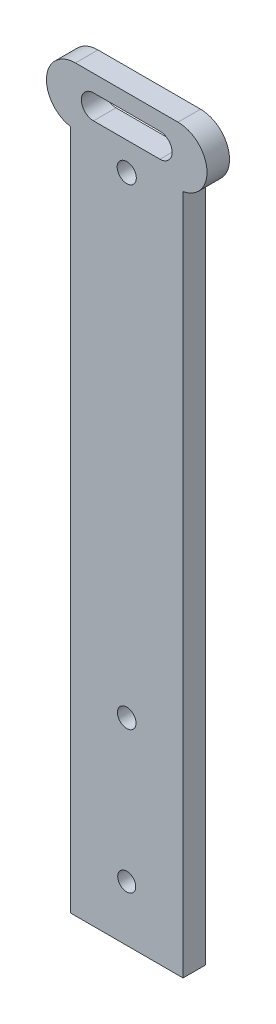
ISO-10303-21;
HEADER;
FILE_DESCRIPTION(('STEP AP214'),'2;1');
FILE_NAME('part.step','',(''),(''),'','','');
FILE_SCHEMA(('AUTOMOTIVE_DESIGN { 1 0 10303 214 1 1 1 1 }'));
ENDSEC;
DATA;
#1=APPLICATION_CONTEXT('core data for automotive mechanical design processes');
#2=APPLICATION_PROTOCOL_DEFINITION('international standard','automotive_design',2000,#1);
#3=PRODUCT_CONTEXT('',#1,'mechanical');
#4=PRODUCT('Part','Part','',(#3));
#5=PRODUCT_RELATED_PRODUCT_CATEGORY('part','',(#4));
#6=PRODUCT_DEFINITION_FORMATION('','',#4);
#7=PRODUCT_DEFINITION_CONTEXT('part definition',#1,'design');
#8=PRODUCT_DEFINITION('design','',#6,#7);
#9=PRODUCT_DEFINITION_SHAPE('','',#8);
#10=(LENGTH_UNIT() NAMED_UNIT(*) SI_UNIT(.MILLI.,.METRE.));
#11=(NAMED_UNIT(*) PLANE_ANGLE_UNIT() SI_UNIT($,.RADIAN.));
#12=(NAMED_UNIT(*) SI_UNIT($,.STERADIAN.) SOLID_ANGLE_UNIT());
#13=UNCERTAINTY_MEASURE_WITH_UNIT(LENGTH_MEASURE(1.E-05),#10,'distance_accuracy_value','');
#14=(GEOMETRIC_REPRESENTATION_CONTEXT(3) GLOBAL_UNCERTAINTY_ASSIGNED_CONTEXT((#13)) GLOBAL_UNIT_ASSIGNED_CONTEXT((#10,
#11,#12)) REPRESENTATION_CONTEXT('',''));
#15=CARTESIAN_POINT('',(0.,0.,0.));
#16=DIRECTION('',(0.,0.,1.));
#17=DIRECTION('',(1.,0.,0.));
#18=AXIS2_PLACEMENT_3D('',#15,#16,#17);
#19=CARTESIAN_POINT('',(0.,0.,0.));
#20=DIRECTION('',(0.,0.,1.));
#21=DIRECTION('',(1.,0.,0.));
#22=AXIS2_PLACEMENT_3D('',#19,#20,#21);
#23=PLANE('',#22);
#24=CARTESIAN_POINT('',(10.,-88.82,0.));
#25=DIRECTION('',(0.,0.,-1.));
#26=DIRECTION('',(-1.,0.,0.));
#27=AXIS2_PLACEMENT_3D('',#24,#25,#26);
#28=CIRCLE('',#27,1.65);
#29=CARTESIAN_POINT('',(8.35,-88.82,0.));
#30=VERTEX_POINT('',#29);
#31=EDGE_CURVE('E251',#30,#30,#28,.T.);
#32=ORIENTED_EDGE('',*,*,#31,.F.);
#33=EDGE_LOOP('',(#32));
#34=FACE_BOUND('',#33,.T.);
#35=DIRECTION('',(0.,1.,0.));
#36=VECTOR('',#35,1.);
#37=CARTESIAN_POINT('',(20.,-124.,0.));
#38=LINE('',#37,#36);
#39=CARTESIAN_POINT('',(20.,-2.92085704174845,0.));
#40=VERTEX_POINT('',#39);
#41=CARTESIAN_POINT('',(20.,-123.82,0.));
#42=VERTEX_POINT('',#41);
#43=EDGE_CURVE('E130',#40,#42,#38,.F.);
#44=ORIENTED_EDGE('',*,*,#43,.T.);
#45=DIRECTION('',(1.,0.,0.));
#46=VECTOR('',#45,1.);
#47=CARTESIAN_POINT('',(20.,-123.82,0.));
#48=LINE('',#47,#46);
#49=CARTESIAN_POINT('',(0.,-123.82,0.));
#50=VERTEX_POINT('',#49);
#51=EDGE_CURVE('E115',#50,#42,#48,.T.);
#52=ORIENTED_EDGE('',*,*,#51,.F.);
#53=DIRECTION('',(0.,1.,0.));
#54=VECTOR('',#53,1.);
#55=CARTESIAN_POINT('',(0.,0.,0.));
#56=LINE('',#55,#54);
#57=CARTESIAN_POINT('',(0.,-2.92085704174845,0.));
#58=VERTEX_POINT('',#57);
#59=EDGE_CURVE('E127',#50,#58,#56,.T.);
#60=ORIENTED_EDGE('',*,*,#59,.T.);
#61=CARTESIAN_POINT('',(0.899393608021611,2.15,0.));
#62=DIRECTION('',(0.,0.,1.));
#63=DIRECTION('',(1.,0.,0.));
#64=AXIS2_PLACEMENT_3D('',#61,#62,#63);
#65=CIRCLE('',#64,5.15);
#66=CARTESIAN_POINT('',(0.89939360802161,7.3,0.));
#67=VERTEX_POINT('',#66);
#68=EDGE_CURVE('E135',#67,#58,#65,.T.);
#69=ORIENTED_EDGE('',*,*,#68,.F.);
#70=DIRECTION('',(-1.,0.,0.));
#71=VECTOR('',#70,1.);
#72=CARTESIAN_POINT('',(0.899393608021611,7.3,0.));
#73=LINE('',#72,#71);
#74=CARTESIAN_POINT('',(19.1006063919784,7.3,0.));
#75=VERTEX_POINT('',#74);
#76=EDGE_CURVE('E199',#75,#67,#73,.T.);
#77=ORIENTED_EDGE('',*,*,#76,.F.);
#78=CARTESIAN_POINT('',(19.1006063919784,2.15,0.));
#79=DIRECTION('',(0.,0.,1.));
#80=DIRECTION('',(1.,0.,0.));
#81=AXIS2_PLACEMENT_3D('',#78,#79,#80);
#82=CIRCLE('',#81,5.15);
#83=EDGE_CURVE('E174',#40,#75,#82,.T.);
#84=ORIENTED_EDGE('',*,*,#83,.F.);
#85=EDGE_LOOP('',(#44,#52,#60,#69,#77,#84));
#86=FACE_BOUND('',#85,.T.);
#87=DIRECTION('',(1.,0.,0.));
#88=VECTOR('',#87,1.);
#89=CARTESIAN_POINT('',(20.,0.,0.));
#90=LINE('',#89,#88);
#91=CARTESIAN_POINT('',(4.09999999999998,0.,0.));
#92=VERTEX_POINT('',#91);
#93=CARTESIAN_POINT('',(15.9,0.,0.));
#94=VERTEX_POINT('',#93);
#95=EDGE_CURVE('E149',#92,#94,#90,.T.);
#96=ORIENTED_EDGE('',*,*,#95,.T.);
#97=CARTESIAN_POINT('',(15.9,2.15,0.));
#98=DIRECTION('',(0.,0.,1.));
#99=DIRECTION('',(1.,0.,0.));
#100=AXIS2_PLACEMENT_3D('',#97,#98,#99);
#101=CIRCLE('',#100,2.15);
#102=CARTESIAN_POINT('',(15.9,4.3,0.));
#103=VERTEX_POINT('',#102);
#104=EDGE_CURVE('E108',#94,#103,#101,.T.);
#105=ORIENTED_EDGE('',*,*,#104,.T.);
#106=DIRECTION('',(-1.,0.,0.));
#107=VECTOR('',#106,1.);
#108=CARTESIAN_POINT('',(4.09999999999998,4.3,0.));
#109=LINE('',#108,#107);
#110=CARTESIAN_POINT('',(4.09999999999998,4.3,0.));
#111=VERTEX_POINT('',#110);
#112=EDGE_CURVE('E145',#103,#111,#109,.T.);
#113=ORIENTED_EDGE('',*,*,#112,.T.);
#114=CARTESIAN_POINT('',(4.09999999999998,2.15,0.));
#115=DIRECTION('',(0.,0.,1.));
#116=DIRECTION('',(1.,0.,0.));
#117=AXIS2_PLACEMENT_3D('',#114,#115,#116);
#118=CIRCLE('',#117,2.15);
#119=EDGE_CURVE('E151',#111,#92,#118,.T.);
#120=ORIENTED_EDGE('',*,*,#119,.T.);
#121=EDGE_LOOP('',(#96,#105,#113,#120));
#122=FACE_BOUND('',#121,.T.);
#123=CARTESIAN_POINT('',(9.99999999999974,-4.99999999999974,0.));
#124=DIRECTION('',(0.,0.,1.));
#125=DIRECTION('',(1.,0.,0.));
#126=AXIS2_PLACEMENT_3D('',#123,#124,#125);
#127=CIRCLE('',#126,1.7);
#128=CARTESIAN_POINT('',(11.6999999999997,-4.99999999999974,0.));
#129=VERTEX_POINT('',#128);
#130=EDGE_CURVE('E181',#129,#129,#127,.T.);
#131=ORIENTED_EDGE('',*,*,#130,.T.);
#132=EDGE_LOOP('',(#131));
#133=FACE_BOUND('',#132,.T.);
#134=CARTESIAN_POINT('',(10.,-114.,0.));
#135=DIRECTION('',(0.,0.,1.));
#136=DIRECTION('',(1.,0.,0.));
#137=AXIS2_PLACEMENT_3D('',#134,#135,#136);
#138=CIRCLE('',#137,1.6);
#139=CARTESIAN_POINT('',(11.6,-114.,0.));
#140=VERTEX_POINT('',#139);
#141=EDGE_CURVE('E184',#140,#140,#138,.T.);
#142=ORIENTED_EDGE('',*,*,#141,.T.);
#143=EDGE_LOOP('',(#142));
#144=FACE_BOUND('',#143,.T.);
#145=ADVANCED_FACE('F34',(#34,#86,#122,#133,#144),#23,.F.);
#146=CARTESIAN_POINT('',(10.,-114.,0.));
#147=DIRECTION('',(0.,0.,1.));
#148=DIRECTION('',(1.,0.,0.));
#149=AXIS2_PLACEMENT_3D('',#146,#147,#148);
#150=CYLINDRICAL_SURFACE('',#149,1.6);
#151=CARTESIAN_POINT('',(10.,-114.,4.));
#152=DIRECTION('',(0.,0.,1.));
#153=DIRECTION('',(1.,0.,0.));
#154=AXIS2_PLACEMENT_3D('',#151,#152,#153);
#155=CIRCLE('',#154,1.6);
#156=CARTESIAN_POINT('',(11.6,-114.,4.));
#157=VERTEX_POINT('',#156);
#158=EDGE_CURVE('E170',#157,#157,#155,.F.);
#159=ORIENTED_EDGE('',*,*,#158,.F.);
#160=EDGE_LOOP('',(#159));
#161=FACE_BOUND('',#160,.T.);
#162=ORIENTED_EDGE('',*,*,#141,.F.);
#163=EDGE_LOOP('',(#162));
#164=FACE_BOUND('',#163,.T.);
#165=ADVANCED_FACE('F256',(#161,#164),#150,.F.);
#166=CARTESIAN_POINT('',(9.99999999999974,-4.99999999999974,0.));
#167=DIRECTION('',(0.,0.,1.));
#168=DIRECTION('',(1.,0.,0.));
#169=AXIS2_PLACEMENT_3D('',#166,#167,#168);
#170=CYLINDRICAL_SURFACE('',#169,1.7);
#171=CARTESIAN_POINT('',(9.99999999999974,-4.99999999999974,4.));
#172=DIRECTION('',(0.,0.,1.));
#173=DIRECTION('',(1.,0.,0.));
#174=AXIS2_PLACEMENT_3D('',#171,#172,#173);
#175=CIRCLE('',#174,1.7);
#176=CARTESIAN_POINT('',(11.6999999999997,-4.99999999999974,4.));
#177=VERTEX_POINT('',#176);
#178=EDGE_CURVE('E167',#177,#177,#175,.F.);
#179=ORIENTED_EDGE('',*,*,#178,.F.);
#180=EDGE_LOOP('',(#179));
#181=FACE_BOUND('',#180,.T.);
#182=ORIENTED_EDGE('',*,*,#130,.F.);
#183=EDGE_LOOP('',(#182));
#184=FACE_BOUND('',#183,.T.);
#185=ADVANCED_FACE('F260',(#181,#184),#170,.F.);
#186=CARTESIAN_POINT('',(20.,0.,4.));
#187=DIRECTION('',(0.,-1.,0.));
#188=DIRECTION('',(0.,0.,-1.));
#189=AXIS2_PLACEMENT_3D('',#186,#187,#188);
#190=PLANE('',#189);
#191=DIRECTION('',(0.,0.,1.));
#192=VECTOR('',#191,1.);
#193=CARTESIAN_POINT('',(4.09999999999998,0.,0.));
#194=LINE('',#193,#192);
#195=CARTESIAN_POINT('',(4.09999999999998,0.,4.));
#196=VERTEX_POINT('',#195);
#197=EDGE_CURVE('E148',#92,#196,#194,.T.);
#198=ORIENTED_EDGE('',*,*,#197,.T.);
#199=DIRECTION('',(1.,0.,0.));
#200=VECTOR('',#199,1.);
#201=CARTESIAN_POINT('',(0.,0.,4.));
#202=LINE('',#201,#200);
#203=CARTESIAN_POINT('',(15.9,0.,4.));
#204=VERTEX_POINT('',#203);
#205=EDGE_CURVE('E163',#204,#196,#202,.F.);
#206=ORIENTED_EDGE('',*,*,#205,.F.);
#207=DIRECTION('',(0.,0.,-1.));
#208=VECTOR('',#207,1.);
#209=CARTESIAN_POINT('',(15.9,0.,4.));
#210=LINE('',#209,#208);
#211=EDGE_CURVE('E152',#94,#204,#210,.F.);
#212=ORIENTED_EDGE('',*,*,#211,.F.);
#213=ORIENTED_EDGE('',*,*,#95,.F.);
#214=EDGE_LOOP('',(#198,#206,#212,#213));
#215=FACE_BOUND('',#214,.T.);
#216=ADVANCED_FACE('F265',(#215),#190,.F.);
#217=CARTESIAN_POINT('',(4.09999999999998,2.15,0.));
#218=DIRECTION('',(0.,0.,1.));
#219=DIRECTION('',(1.,0.,0.));
#220=AXIS2_PLACEMENT_3D('',#217,#218,#219);
#221=CYLINDRICAL_SURFACE('',#220,2.15);
#222=ORIENTED_EDGE('',*,*,#197,.F.);
#223=ORIENTED_EDGE('',*,*,#119,.F.);
#224=DIRECTION('',(0.,0.,1.));
#225=VECTOR('',#224,1.);
#226=CARTESIAN_POINT('',(4.09999999999998,4.3,0.));
#227=LINE('',#226,#225);
#228=CARTESIAN_POINT('',(4.09999999999998,4.3,4.));
#229=VERTEX_POINT('',#228);
#230=EDGE_CURVE('E147',#111,#229,#227,.T.);
#231=ORIENTED_EDGE('',*,*,#230,.T.);
#232=CARTESIAN_POINT('',(4.09999999999998,2.15,4.));
#233=DIRECTION('',(0.,0.,1.));
#234=DIRECTION('',(1.,0.,0.));
#235=AXIS2_PLACEMENT_3D('',#232,#233,#234);
#236=CIRCLE('',#235,2.15);
#237=EDGE_CURVE('E160',#196,#229,#236,.F.);
#238=ORIENTED_EDGE('',*,*,#237,.F.);
#239=EDGE_LOOP('',(#222,#223,#231,#238));
#240=FACE_BOUND('',#239,.T.);
#241=ADVANCED_FACE('F273',(#240),#221,.F.);
#242=CARTESIAN_POINT('',(4.09999999999998,4.3,0.));
#243=DIRECTION('',(0.,1.,0.));
#244=DIRECTION('',(-1.,0.,0.));
#245=AXIS2_PLACEMENT_3D('',#242,#243,#244);
#246=PLANE('',#245);
#247=ORIENTED_EDGE('',*,*,#230,.F.);
#248=ORIENTED_EDGE('',*,*,#112,.F.);
#249=DIRECTION('',(0.,0.,1.));
#250=VECTOR('',#249,1.);
#251=CARTESIAN_POINT('',(15.9,4.3,0.));
#252=LINE('',#251,#250);
#253=CARTESIAN_POINT('',(15.9,4.3,4.));
#254=VERTEX_POINT('',#253);
#255=EDGE_CURVE('E179',#103,#254,#252,.T.);
#256=ORIENTED_EDGE('',*,*,#255,.T.);
#257=DIRECTION('',(1.,0.,0.));
#258=VECTOR('',#257,1.);
#259=CARTESIAN_POINT('',(0.,4.3,4.));
#260=LINE('',#259,#258);
#261=EDGE_CURVE('E159',#229,#254,#260,.T.);
#262=ORIENTED_EDGE('',*,*,#261,.F.);
#263=EDGE_LOOP('',(#247,#248,#256,#262));
#264=FACE_BOUND('',#263,.T.);
#265=ADVANCED_FACE('F277',(#264),#246,.F.);
#266=CARTESIAN_POINT('',(15.9,2.15,0.));
#267=DIRECTION('',(0.,0.,1.));
#268=DIRECTION('',(1.,0.,0.));
#269=AXIS2_PLACEMENT_3D('',#266,#267,#268);
#270=CYLINDRICAL_SURFACE('',#269,2.15);
#271=ORIENTED_EDGE('',*,*,#104,.F.);
#272=ORIENTED_EDGE('',*,*,#211,.T.);
#273=CARTESIAN_POINT('',(15.9,2.15,4.));
#274=DIRECTION('',(0.,0.,1.));
#275=DIRECTION('',(1.,0.,0.));
#276=AXIS2_PLACEMENT_3D('',#273,#274,#275);
#277=CIRCLE('',#276,2.15);
#278=EDGE_CURVE('E164',#254,#204,#277,.F.);
#279=ORIENTED_EDGE('',*,*,#278,.F.);
#280=ORIENTED_EDGE('',*,*,#255,.F.);
#281=EDGE_LOOP('',(#271,#272,#279,#280));
#282=FACE_BOUND('',#281,.T.);
#283=ADVANCED_FACE('F281',(#282),#270,.F.);
#284=CARTESIAN_POINT('',(0.899393608021611,2.15,0.));
#285=DIRECTION('',(0.,0.,1.));
#286=DIRECTION('',(1.,0.,0.));
#287=AXIS2_PLACEMENT_3D('',#284,#285,#286);
#288=CYLINDRICAL_SURFACE('',#287,5.15);
#289=DIRECTION('',(0.,0.,1.));
#290=VECTOR('',#289,1.);
#291=CARTESIAN_POINT('',(0.899393608021611,7.3,0.));
#292=LINE('',#291,#290);
#293=CARTESIAN_POINT('',(0.899393608021611,7.3,4.));
#294=VERTEX_POINT('',#293);
#295=EDGE_CURVE('E173',#67,#294,#292,.T.);
#296=ORIENTED_EDGE('',*,*,#295,.F.);
#297=ORIENTED_EDGE('',*,*,#68,.T.);
#298=DIRECTION('',(0.,0.,-1.));
#299=VECTOR('',#298,1.);
#300=CARTESIAN_POINT('',(0.,-2.92085704174845,4.));
#301=LINE('',#300,#299);
#302=CARTESIAN_POINT('',(0.,-2.92085704174845,4.));
#303=VERTEX_POINT('',#302);
#304=EDGE_CURVE('E134',#58,#303,#301,.F.);
#305=ORIENTED_EDGE('',*,*,#304,.T.);
#306=CARTESIAN_POINT('',(0.899393608021611,2.15,4.));
#307=DIRECTION('',(0.,0.,1.));
#308=DIRECTION('',(1.,0.,0.));
#309=AXIS2_PLACEMENT_3D('',#306,#307,#308);
#310=CIRCLE('',#309,5.15);
#311=EDGE_CURVE('E155',#294,#303,#310,.T.);
#312=ORIENTED_EDGE('',*,*,#311,.F.);
#313=EDGE_LOOP('',(#296,#297,#305,#312));
#314=FACE_BOUND('',#313,.T.);
#315=ADVANCED_FACE('F216',(#314),#288,.T.);
#316=CARTESIAN_POINT('',(0.,0.,4.));
#317=DIRECTION('',(1.,0.,0.));
#318=DIRECTION('',(0.,0.,-1.));
#319=AXIS2_PLACEMENT_3D('',#316,#317,#318);
#320=PLANE('',#319);
#321=ORIENTED_EDGE('',*,*,#59,.F.);
#322=DIRECTION('',(0.,0.,-1.));
#323=VECTOR('',#322,1.);
#324=CARTESIAN_POINT('',(0.,-123.82,10.));
#325=LINE('',#324,#323);
#326=CARTESIAN_POINT('',(0.,-123.82,4.));
#327=VERTEX_POINT('',#326);
#328=EDGE_CURVE('E117',#327,#50,#325,.T.);
#329=ORIENTED_EDGE('',*,*,#328,.F.);
#330=DIRECTION('',(0.,1.,0.));
#331=VECTOR('',#330,1.);
#332=CARTESIAN_POINT('',(0.,0.,4.));
#333=LINE('',#332,#331);
#334=EDGE_CURVE('E158',#303,#327,#333,.F.);
#335=ORIENTED_EDGE('',*,*,#334,.F.);
#336=ORIENTED_EDGE('',*,*,#304,.F.);
#337=EDGE_LOOP('',(#321,#329,#335,#336));
#338=FACE_BOUND('',#337,.T.);
#339=ADVANCED_FACE('F133',(#338),#320,.F.);
#340=CARTESIAN_POINT('',(20.,-124.,4.));
#341=DIRECTION('',(-1.,0.,0.));
#342=DIRECTION('',(0.,0.,1.));
#343=AXIS2_PLACEMENT_3D('',#340,#341,#342);
#344=PLANE('',#343);
#345=DIRECTION('',(0.,1.,0.));
#346=VECTOR('',#345,1.);
#347=CARTESIAN_POINT('',(20.,0.,4.));
#348=LINE('',#347,#346);
#349=CARTESIAN_POINT('',(20.,-123.82,4.));
#350=VERTEX_POINT('',#349);
#351=CARTESIAN_POINT('',(20.,-2.92085704174845,4.));
#352=VERTEX_POINT('',#351);
#353=EDGE_CURVE('E154',#350,#352,#348,.T.);
#354=ORIENTED_EDGE('',*,*,#353,.F.);
#355=DIRECTION('',(0.,0.,-1.));
#356=VECTOR('',#355,1.);
#357=CARTESIAN_POINT('',(20.,-123.82,10.));
#358=LINE('',#357,#356);
#359=EDGE_CURVE('E49',#350,#42,#358,.T.);
#360=ORIENTED_EDGE('',*,*,#359,.T.);
#361=ORIENTED_EDGE('',*,*,#43,.F.);
#362=DIRECTION('',(0.,0.,1.));
#363=VECTOR('',#362,1.);
#364=CARTESIAN_POINT('',(20.,-2.92085704174845,0.));
#365=LINE('',#364,#363);
#366=EDGE_CURVE('E176',#352,#40,#365,.F.);
#367=ORIENTED_EDGE('',*,*,#366,.F.);
#368=EDGE_LOOP('',(#354,#360,#361,#367));
#369=FACE_BOUND('',#368,.T.);
#370=ADVANCED_FACE('F222',(#369),#344,.F.);
#371=CARTESIAN_POINT('',(19.1006063919784,2.15,0.));
#372=DIRECTION('',(0.,0.,1.));
#373=DIRECTION('',(1.,0.,0.));
#374=AXIS2_PLACEMENT_3D('',#371,#372,#373);
#375=CYLINDRICAL_SURFACE('',#374,5.15);
#376=DIRECTION('',(0.,0.,1.));
#377=VECTOR('',#376,1.);
#378=CARTESIAN_POINT('',(19.1006063919784,7.3,0.));
#379=LINE('',#378,#377);
#380=CARTESIAN_POINT('',(19.1006063919784,7.3,4.));
#381=VERTEX_POINT('',#380);
#382=EDGE_CURVE('E175',#381,#75,#379,.F.);
#383=ORIENTED_EDGE('',*,*,#382,.F.);
#384=CARTESIAN_POINT('',(19.1006063919784,2.15,4.));
#385=DIRECTION('',(0.,0.,1.));
#386=DIRECTION('',(1.,0.,0.));
#387=AXIS2_PLACEMENT_3D('',#384,#385,#386);
#388=CIRCLE('',#387,5.15);
#389=EDGE_CURVE('E58',#352,#381,#388,.T.);
#390=ORIENTED_EDGE('',*,*,#389,.F.);
#391=ORIENTED_EDGE('',*,*,#366,.T.);
#392=ORIENTED_EDGE('',*,*,#83,.T.);
#393=EDGE_LOOP('',(#383,#390,#391,#392));
#394=FACE_BOUND('',#393,.T.);
#395=ADVANCED_FACE('F224',(#394),#375,.T.);
#396=CARTESIAN_POINT('',(0.899393608021611,7.3,0.));
#397=DIRECTION('',(0.,1.,0.));
#398=DIRECTION('',(-1.,0.,0.));
#399=AXIS2_PLACEMENT_3D('',#396,#397,#398);
#400=PLANE('',#399);
#401=ORIENTED_EDGE('',*,*,#76,.T.);
#402=ORIENTED_EDGE('',*,*,#295,.T.);
#403=DIRECTION('',(1.,0.,0.));
#404=VECTOR('',#403,1.);
#405=CARTESIAN_POINT('',(0.,7.3,4.));
#406=LINE('',#405,#404);
#407=EDGE_CURVE('E42',#381,#294,#406,.F.);
#408=ORIENTED_EDGE('',*,*,#407,.F.);
#409=ORIENTED_EDGE('',*,*,#382,.T.);
#410=EDGE_LOOP('',(#401,#402,#408,#409));
#411=FACE_BOUND('',#410,.T.);
#412=ADVANCED_FACE('F212',(#411),#400,.T.);
#413=CARTESIAN_POINT('',(0.,0.,4.));
#414=DIRECTION('',(0.,0.,1.));
#415=DIRECTION('',(1.,0.,0.));
#416=AXIS2_PLACEMENT_3D('',#413,#414,#415);
#417=PLANE('',#416);
#418=CARTESIAN_POINT('',(10.,-88.82,4.));
#419=DIRECTION('',(0.,0.,1.));
#420=DIRECTION('',(1.,0.,0.));
#421=AXIS2_PLACEMENT_3D('',#418,#419,#420);
#422=CIRCLE('',#421,1.65);
#423=CARTESIAN_POINT('',(11.65,-88.82,4.));
#424=VERTEX_POINT('',#423);
#425=EDGE_CURVE('E37',#424,#424,#422,.T.);
#426=ORIENTED_EDGE('',*,*,#425,.F.);
#427=EDGE_LOOP('',(#426));
#428=FACE_BOUND('',#427,.T.);
#429=DIRECTION('',(-1.,0.,0.));
#430=VECTOR('',#429,1.);
#431=CARTESIAN_POINT('',(0.,-123.82,4.));
#432=LINE('',#431,#430);
#433=EDGE_CURVE('E11',#350,#327,#432,.T.);
#434=ORIENTED_EDGE('',*,*,#433,.F.);
#435=ORIENTED_EDGE('',*,*,#353,.T.);
#436=ORIENTED_EDGE('',*,*,#389,.T.);
#437=ORIENTED_EDGE('',*,*,#407,.T.);
#438=ORIENTED_EDGE('',*,*,#311,.T.);
#439=ORIENTED_EDGE('',*,*,#334,.T.);
#440=EDGE_LOOP('',(#434,#435,#436,#437,#438,#439));
#441=FACE_BOUND('',#440,.T.);
#442=ORIENTED_EDGE('',*,*,#261,.T.);
#443=ORIENTED_EDGE('',*,*,#278,.T.);
#444=ORIENTED_EDGE('',*,*,#205,.T.);
#445=ORIENTED_EDGE('',*,*,#237,.T.);
#446=EDGE_LOOP('',(#442,#443,#444,#445));
#447=FACE_BOUND('',#446,.T.);
#448=ORIENTED_EDGE('',*,*,#178,.T.);
#449=EDGE_LOOP('',(#448));
#450=FACE_BOUND('',#449,.T.);
#451=ORIENTED_EDGE('',*,*,#158,.T.);
#452=EDGE_LOOP('',(#451));
#453=FACE_BOUND('',#452,.T.);
#454=ADVANCED_FACE('F217',(#428,#441,#447,#450,#453),#417,.T.);
#455=CARTESIAN_POINT('',(20.,-123.82,10.));
#456=DIRECTION('',(0.,1.,0.));
#457=DIRECTION('',(0.,0.,1.));
#458=AXIS2_PLACEMENT_3D('',#455,#456,#457);
#459=PLANE('',#458);
#460=ORIENTED_EDGE('',*,*,#433,.T.);
#461=ORIENTED_EDGE('',*,*,#328,.T.);
#462=ORIENTED_EDGE('',*,*,#51,.T.);
#463=ORIENTED_EDGE('',*,*,#359,.F.);
#464=EDGE_LOOP('',(#460,#461,#462,#463));
#465=FACE_BOUND('',#464,.T.);
#466=ADVANCED_FACE('F118',(#465),#459,.F.);
#467=CARTESIAN_POINT('',(10.,-88.82,38.));
#468=DIRECTION('',(0.,0.,-1.));
#469=DIRECTION('',(-1.,0.,0.));
#470=AXIS2_PLACEMENT_3D('',#467,#468,#469);
#471=CYLINDRICAL_SURFACE('',#470,1.65);
#472=ORIENTED_EDGE('',*,*,#425,.T.);
#473=EDGE_LOOP('',(#472));
#474=FACE_BOUND('',#473,.T.);
#475=ORIENTED_EDGE('',*,*,#31,.T.);
#476=EDGE_LOOP('',(#475));
#477=FACE_BOUND('',#476,.T.);
#478=ADVANCED_FACE('F239',(#474,#477),#471,.F.);
#479=CLOSED_SHELL('',(#145,#165,#185,#216,#241,#265,#283,#315,#339,#370,#395,#412,#454,#466,#478));
#480=MANIFOLD_SOLID_BREP('B2',#479);
#481=ADVANCED_BREP_SHAPE_REPRESENTATION('',(#18,#480),#14);
#482=SHAPE_DEFINITION_REPRESENTATION(#9,#481);
ENDSEC;
END-ISO-10303-21;
